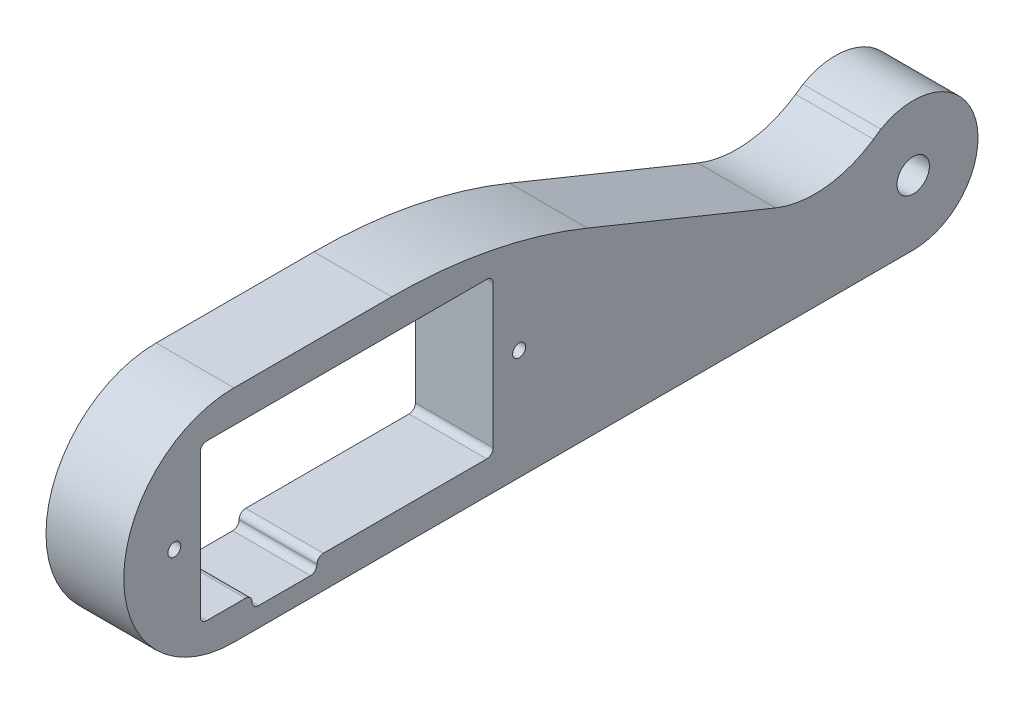
ISO-10303-21;
HEADER;
FILE_DESCRIPTION(('STEP AP214'),'2;1');
FILE_NAME('part.step','',(''),(''),'','','');
FILE_SCHEMA(('AUTOMOTIVE_DESIGN { 1 0 10303 214 1 1 1 1 }'));
ENDSEC;
DATA;
#1=APPLICATION_CONTEXT('core data for automotive mechanical design processes');
#2=APPLICATION_PROTOCOL_DEFINITION('international standard','automotive_design',2000,#1);
#3=PRODUCT_CONTEXT('',#1,'mechanical');
#4=PRODUCT('Part','Part','',(#3));
#5=PRODUCT_RELATED_PRODUCT_CATEGORY('part','',(#4));
#6=PRODUCT_DEFINITION_FORMATION('','',#4);
#7=PRODUCT_DEFINITION_CONTEXT('part definition',#1,'design');
#8=PRODUCT_DEFINITION('design','',#6,#7);
#9=PRODUCT_DEFINITION_SHAPE('','',#8);
#10=(LENGTH_UNIT() NAMED_UNIT(*) SI_UNIT(.MILLI.,.METRE.));
#11=(NAMED_UNIT(*) PLANE_ANGLE_UNIT() SI_UNIT($,.RADIAN.));
#12=(NAMED_UNIT(*) SI_UNIT($,.STERADIAN.) SOLID_ANGLE_UNIT());
#13=UNCERTAINTY_MEASURE_WITH_UNIT(LENGTH_MEASURE(1.E-05),#10,'distance_accuracy_value','');
#14=(GEOMETRIC_REPRESENTATION_CONTEXT(3) GLOBAL_UNCERTAINTY_ASSIGNED_CONTEXT((#13)) GLOBAL_UNIT_ASSIGNED_CONTEXT((#10,
#11,#12)) REPRESENTATION_CONTEXT('',''));
#15=CARTESIAN_POINT('',(0.,0.,0.));
#16=DIRECTION('',(0.,0.,1.));
#17=DIRECTION('',(1.,0.,0.));
#18=AXIS2_PLACEMENT_3D('',#15,#16,#17);
#19=CARTESIAN_POINT('',(6.,-25.5,-14.766012454293));
#20=DIRECTION('',(-1.,0.,0.));
#21=DIRECTION('',(0.,0.,1.));
#22=AXIS2_PLACEMENT_3D('',#19,#20,#21);
#23=CYLINDRICAL_SURFACE('',#22,40.);
#24=DIRECTION('',(-1.,0.,0.));
#25=VECTOR('',#24,1.);
#26=CARTESIAN_POINT('',(6.,14.5,-14.766012454293));
#27=LINE('',#26,#25);
#28=CARTESIAN_POINT('',(6.,14.5,-14.766012454293));
#29=VERTEX_POINT('',#28);
#30=CARTESIAN_POINT('',(0.,14.5,-14.766012454293));
#31=VERTEX_POINT('',#30);
#32=EDGE_CURVE('E300',#29,#31,#27,.T.);
#33=ORIENTED_EDGE('',*,*,#32,.F.);
#34=CARTESIAN_POINT('',(6.,-25.5,-14.766012454293));
#35=DIRECTION('',(1.,0.,0.));
#36=DIRECTION('',(0.,0.,-1.));
#37=AXIS2_PLACEMENT_3D('',#34,#35,#36);
#38=CIRCLE('',#37,40.);
#39=CARTESIAN_POINT('',(6.,11.5447854194722,-29.8552096902383));
#40=VERTEX_POINT('',#39);
#41=EDGE_CURVE('E306',#40,#29,#38,.T.);
#42=ORIENTED_EDGE('',*,*,#41,.F.);
#43=DIRECTION('',(-1.,0.,0.));
#44=VECTOR('',#43,1.);
#45=CARTESIAN_POINT('',(6.,11.5447854194722,-29.8552096902383));
#46=LINE('',#45,#44);
#47=CARTESIAN_POINT('',(0.,11.5447854194722,-29.8552096902383));
#48=VERTEX_POINT('',#47);
#49=EDGE_CURVE('E303',#48,#40,#46,.F.);
#50=ORIENTED_EDGE('',*,*,#49,.F.);
#51=CARTESIAN_POINT('',(0.,-25.5,-14.766012454293));
#52=DIRECTION('',(1.,0.,0.));
#53=DIRECTION('',(0.,0.,-1.));
#54=AXIS2_PLACEMENT_3D('',#51,#52,#53);
#55=CIRCLE('',#54,40.);
#56=EDGE_CURVE('E308',#31,#48,#55,.F.);
#57=ORIENTED_EDGE('',*,*,#56,.F.);
#58=EDGE_LOOP('',(#33,#42,#50,#57));
#59=FACE_BOUND('',#58,.T.);
#60=ADVANCED_FACE('F38',(#59),#23,.T.);
#61=CARTESIAN_POINT('',(6.,13.0351102224386,-47.4036076154779));
#62=DIRECTION('',(-1.,0.,0.));
#63=DIRECTION('',(0.,0.,1.));
#64=AXIS2_PLACEMENT_3D('',#61,#62,#63);
#65=CYLINDRICAL_SURFACE('',#64,8.);
#66=DIRECTION('',(1.,0.,0.));
#67=VECTOR('',#66,1.);
#68=CARTESIAN_POINT('',(6.,6.44000783465699,-51.9318108457534));
#69=LINE('',#68,#67);
#70=CARTESIAN_POINT('',(0.,6.44000783465699,-51.9318108457534));
#71=VERTEX_POINT('',#70);
#72=CARTESIAN_POINT('',(6.,6.44000783465699,-51.9318108457534));
#73=VERTEX_POINT('',#72);
#74=EDGE_CURVE('E200',#71,#73,#69,.T.);
#75=ORIENTED_EDGE('',*,*,#74,.F.);
#76=CARTESIAN_POINT('',(0.,13.0351102224386,-47.4036076154779));
#77=DIRECTION('',(1.,0.,0.));
#78=DIRECTION('',(0.,0.,-1.));
#79=AXIS2_PLACEMENT_3D('',#76,#77,#78);
#80=CIRCLE('',#79,8.);
#81=CARTESIAN_POINT('',(0.,5.62615313854414,-44.3857681682888));
#82=VERTEX_POINT('',#81);
#83=EDGE_CURVE('E295',#71,#82,#80,.F.);
#84=ORIENTED_EDGE('',*,*,#83,.T.);
#85=DIRECTION('',(1.,0.,0.));
#86=VECTOR('',#85,1.);
#87=CARTESIAN_POINT('',(6.,5.62615313854414,-44.3857681682889));
#88=LINE('',#87,#86);
#89=CARTESIAN_POINT('',(6.,5.62615313854414,-44.3857681682888));
#90=VERTEX_POINT('',#89);
#91=EDGE_CURVE('E292',#90,#82,#88,.F.);
#92=ORIENTED_EDGE('',*,*,#91,.F.);
#93=CARTESIAN_POINT('',(6.,13.0351102224386,-47.4036076154779));
#94=DIRECTION('',(1.,0.,0.));
#95=DIRECTION('',(0.,0.,-1.));
#96=AXIS2_PLACEMENT_3D('',#93,#94,#95);
#97=CIRCLE('',#96,8.);
#98=EDGE_CURVE('E298',#90,#73,#97,.T.);
#99=ORIENTED_EDGE('',*,*,#98,.T.);
#100=EDGE_LOOP('',(#75,#84,#92,#99));
#101=FACE_BOUND('',#100,.T.);
#102=ADVANCED_FACE('F454',(#101),#65,.F.);
#103=CARTESIAN_POINT('',(6.,0.,0.));
#104=DIRECTION('',(0.,1.,0.));
#105=DIRECTION('',(0.,0.,1.));
#106=AXIS2_PLACEMENT_3D('',#103,#104,#105);
#107=PLANE('',#106);
#108=DIRECTION('',(0.,0.,-1.));
#109=VECTOR('',#108,1.);
#110=CARTESIAN_POINT('',(0.,0.,0.));
#111=LINE('',#110,#109);
#112=CARTESIAN_POINT('',(0.,0.,-9.5));
#113=VERTEX_POINT('',#112);
#114=CARTESIAN_POINT('',(0.,0.,-22.1));
#115=VERTEX_POINT('',#114);
#116=EDGE_CURVE('E267',#113,#115,#111,.T.);
#117=ORIENTED_EDGE('',*,*,#116,.F.);
#118=DIRECTION('',(-1.,0.,0.));
#119=VECTOR('',#118,1.);
#120=CARTESIAN_POINT('',(6.,0.,-9.5));
#121=LINE('',#120,#119);
#122=CARTESIAN_POINT('',(6.,0.,-9.5));
#123=VERTEX_POINT('',#122);
#124=EDGE_CURVE('E331',#113,#123,#121,.F.);
#125=ORIENTED_EDGE('',*,*,#124,.T.);
#126=DIRECTION('',(0.,0.,-1.));
#127=VECTOR('',#126,1.);
#128=CARTESIAN_POINT('',(6.,0.,0.));
#129=LINE('',#128,#127);
#130=CARTESIAN_POINT('',(6.,0.,-22.1));
#131=VERTEX_POINT('',#130);
#132=EDGE_CURVE('E229',#123,#131,#129,.T.);
#133=ORIENTED_EDGE('',*,*,#132,.T.);
#134=DIRECTION('',(-1.,0.,0.));
#135=VECTOR('',#134,1.);
#136=CARTESIAN_POINT('',(6.,0.,-22.1));
#137=LINE('',#136,#135);
#138=EDGE_CURVE('E328',#131,#115,#137,.T.);
#139=ORIENTED_EDGE('',*,*,#138,.T.);
#140=EDGE_LOOP('',(#117,#125,#133,#139));
#141=FACE_BOUND('',#140,.T.);
#142=ADVANCED_FACE('F388',(#141),#107,.T.);
#143=CARTESIAN_POINT('',(6.,-1.,0.));
#144=DIRECTION('',(0.,1.,0.));
#145=DIRECTION('',(0.,0.,1.));
#146=AXIS2_PLACEMENT_3D('',#143,#144,#145);
#147=PLANE('',#146);
#148=DIRECTION('',(0.,0.,-1.));
#149=VECTOR('',#148,1.);
#150=CARTESIAN_POINT('',(0.,-1.,0.));
#151=LINE('',#150,#149);
#152=CARTESIAN_POINT('',(0.,-1.,-4.5));
#153=VERTEX_POINT('',#152);
#154=CARTESIAN_POINT('',(0.,-1.,-8.5));
#155=VERTEX_POINT('',#154);
#156=EDGE_CURVE('E270',#153,#155,#151,.T.);
#157=ORIENTED_EDGE('',*,*,#156,.F.);
#158=DIRECTION('',(-1.,0.,0.));
#159=VECTOR('',#158,1.);
#160=CARTESIAN_POINT('',(6.,-1.,-4.5));
#161=LINE('',#160,#159);
#162=CARTESIAN_POINT('',(6.,-1.,-4.5));
#163=VERTEX_POINT('',#162);
#164=EDGE_CURVE('E326',#153,#163,#161,.F.);
#165=ORIENTED_EDGE('',*,*,#164,.T.);
#166=DIRECTION('',(0.,0.,-1.));
#167=VECTOR('',#166,1.);
#168=CARTESIAN_POINT('',(6.,-1.,0.));
#169=LINE('',#168,#167);
#170=CARTESIAN_POINT('',(6.,-1.,-8.5));
#171=VERTEX_POINT('',#170);
#172=EDGE_CURVE('E232',#163,#171,#169,.T.);
#173=ORIENTED_EDGE('',*,*,#172,.T.);
#174=DIRECTION('',(-1.,0.,0.));
#175=VECTOR('',#174,1.);
#176=CARTESIAN_POINT('',(6.,-1.,-8.5));
#177=LINE('',#176,#175);
#178=EDGE_CURVE('E323',#171,#155,#177,.T.);
#179=ORIENTED_EDGE('',*,*,#178,.T.);
#180=EDGE_LOOP('',(#157,#165,#173,#179));
#181=FACE_BOUND('',#180,.T.);
#182=ADVANCED_FACE('F432',(#181),#147,.T.);
#183=CARTESIAN_POINT('',(6.,0.,-0.5));
#184=VERTEX_POINT('',#183);
#185=CARTESIAN_POINT('',(6.,0.,-3.5));
#186=VERTEX_POINT('',#185);
#187=EDGE_CURVE('E233',#184,#186,#129,.T.);
#188=ORIENTED_EDGE('',*,*,#187,.T.);
#189=DIRECTION('',(-1.,0.,0.));
#190=VECTOR('',#189,1.);
#191=CARTESIAN_POINT('',(6.,0.,-3.5));
#192=LINE('',#191,#190);
#193=CARTESIAN_POINT('',(0.,0.,-3.5));
#194=VERTEX_POINT('',#193);
#195=EDGE_CURVE('E312',#186,#194,#192,.T.);
#196=ORIENTED_EDGE('',*,*,#195,.T.);
#197=CARTESIAN_POINT('',(0.,0.,-0.5));
#198=VERTEX_POINT('',#197);
#199=EDGE_CURVE('E271',#198,#194,#111,.T.);
#200=ORIENTED_EDGE('',*,*,#199,.F.);
#201=DIRECTION('',(-1.,0.,0.));
#202=VECTOR('',#201,1.);
#203=CARTESIAN_POINT('',(6.,0.,-0.5));
#204=LINE('',#203,#202);
#205=EDGE_CURVE('E310',#198,#184,#204,.F.);
#206=ORIENTED_EDGE('',*,*,#205,.T.);
#207=EDGE_LOOP('',(#188,#196,#200,#206));
#208=FACE_BOUND('',#207,.T.);
#209=ADVANCED_FACE('F420',(#208),#107,.T.);
#210=CARTESIAN_POINT('',(6.,0.,0.));
#211=DIRECTION('',(0.,0.,-1.));
#212=DIRECTION('',(-1.,0.,0.));
#213=AXIS2_PLACEMENT_3D('',#210,#211,#212);
#214=PLANE('',#213);
#215=DIRECTION('',(0.,-1.,0.));
#216=VECTOR('',#215,1.);
#217=CARTESIAN_POINT('',(6.,0.,0.));
#218=LINE('',#217,#216);
#219=CARTESIAN_POINT('',(6.,11.5,0.));
#220=VERTEX_POINT('',#219);
#221=CARTESIAN_POINT('',(6.,0.5,0.));
#222=VERTEX_POINT('',#221);
#223=EDGE_CURVE('E236',#220,#222,#218,.T.);
#224=ORIENTED_EDGE('',*,*,#223,.T.);
#225=DIRECTION('',(-1.,0.,0.));
#226=VECTOR('',#225,1.);
#227=CARTESIAN_POINT('',(0.,0.5,0.));
#228=LINE('',#227,#226);
#229=CARTESIAN_POINT('',(0.,0.5,0.));
#230=VERTEX_POINT('',#229);
#231=EDGE_CURVE('E339',#222,#230,#228,.T.);
#232=ORIENTED_EDGE('',*,*,#231,.T.);
#233=DIRECTION('',(0.,-1.,0.));
#234=VECTOR('',#233,1.);
#235=CARTESIAN_POINT('',(0.,0.,0.));
#236=LINE('',#235,#234);
#237=CARTESIAN_POINT('',(0.,11.5,0.));
#238=VERTEX_POINT('',#237);
#239=EDGE_CURVE('E274',#238,#230,#236,.T.);
#240=ORIENTED_EDGE('',*,*,#239,.F.);
#241=DIRECTION('',(-1.,0.,0.));
#242=VECTOR('',#241,1.);
#243=CARTESIAN_POINT('',(6.,11.5,0.));
#244=LINE('',#243,#242);
#245=EDGE_CURVE('E337',#238,#220,#244,.F.);
#246=ORIENTED_EDGE('',*,*,#245,.T.);
#247=EDGE_LOOP('',(#224,#232,#240,#246));
#248=FACE_BOUND('',#247,.T.);
#249=ADVANCED_FACE('F410',(#248),#214,.T.);
#250=CARTESIAN_POINT('',(6.,12.,0.));
#251=DIRECTION('',(0.,1.,0.));
#252=DIRECTION('',(0.,0.,1.));
#253=AXIS2_PLACEMENT_3D('',#250,#251,#252);
#254=PLANE('',#253);
#255=DIRECTION('',(0.,0.,-1.));
#256=VECTOR('',#255,1.);
#257=CARTESIAN_POINT('',(6.,12.,0.));
#258=LINE('',#257,#256);
#259=CARTESIAN_POINT('',(6.,12.,-0.5));
#260=VERTEX_POINT('',#259);
#261=CARTESIAN_POINT('',(6.,12.,-22.1));
#262=VERTEX_POINT('',#261);
#263=EDGE_CURVE('E239',#260,#262,#258,.T.);
#264=ORIENTED_EDGE('',*,*,#263,.F.);
#265=DIRECTION('',(-1.,0.,0.));
#266=VECTOR('',#265,1.);
#267=CARTESIAN_POINT('',(6.,12.,-0.5));
#268=LINE('',#267,#266);
#269=CARTESIAN_POINT('',(0.,12.,-0.5));
#270=VERTEX_POINT('',#269);
#271=EDGE_CURVE('E344',#260,#270,#268,.T.);
#272=ORIENTED_EDGE('',*,*,#271,.T.);
#273=DIRECTION('',(0.,0.,-1.));
#274=VECTOR('',#273,1.);
#275=CARTESIAN_POINT('',(0.,12.,0.));
#276=LINE('',#275,#274);
#277=CARTESIAN_POINT('',(0.,12.,-22.1));
#278=VERTEX_POINT('',#277);
#279=EDGE_CURVE('E277',#270,#278,#276,.T.);
#280=ORIENTED_EDGE('',*,*,#279,.T.);
#281=DIRECTION('',(-1.,0.,0.));
#282=VECTOR('',#281,1.);
#283=CARTESIAN_POINT('',(6.,12.,-22.1));
#284=LINE('',#283,#282);
#285=EDGE_CURVE('E342',#278,#262,#284,.F.);
#286=ORIENTED_EDGE('',*,*,#285,.T.);
#287=EDGE_LOOP('',(#264,#272,#280,#286));
#288=FACE_BOUND('',#287,.T.);
#289=ADVANCED_FACE('F402',(#288),#254,.F.);
#290=CARTESIAN_POINT('',(6.,6.,-2.6));
#291=DIRECTION('',(-1.,0.,0.));
#292=DIRECTION('',(0.,0.,1.));
#293=AXIS2_PLACEMENT_3D('',#290,#291,#292);
#294=CYLINDRICAL_SURFACE('',#293,8.5);
#295=CARTESIAN_POINT('',(0.,6.,-2.6));
#296=DIRECTION('',(1.,0.,0.));
#297=DIRECTION('',(0.,0.,-1.));
#298=AXIS2_PLACEMENT_3D('',#295,#296,#297);
#299=CIRCLE('',#298,8.5);
#300=CARTESIAN_POINT('',(0.,-2.5,-2.6));
#301=VERTEX_POINT('',#300);
#302=CARTESIAN_POINT('',(0.,14.5,-2.6));
#303=VERTEX_POINT('',#302);
#304=EDGE_CURVE('E196',#301,#303,#299,.F.);
#305=ORIENTED_EDGE('',*,*,#304,.F.);
#306=DIRECTION('',(-1.,0.,0.));
#307=VECTOR('',#306,1.);
#308=CARTESIAN_POINT('',(6.,-2.5,-2.6));
#309=LINE('',#308,#307);
#310=CARTESIAN_POINT('',(6.,-2.5,-2.6));
#311=VERTEX_POINT('',#310);
#312=EDGE_CURVE('E189',#311,#301,#309,.T.);
#313=ORIENTED_EDGE('',*,*,#312,.F.);
#314=CARTESIAN_POINT('',(6.,6.,-2.6));
#315=DIRECTION('',(1.,0.,0.));
#316=DIRECTION('',(0.,0.,-1.));
#317=AXIS2_PLACEMENT_3D('',#314,#315,#316);
#318=CIRCLE('',#317,8.5);
#319=CARTESIAN_POINT('',(6.,14.5,-2.6));
#320=VERTEX_POINT('',#319);
#321=EDGE_CURVE('E193',#311,#320,#318,.F.);
#322=ORIENTED_EDGE('',*,*,#321,.T.);
#323=DIRECTION('',(-1.,0.,0.));
#324=VECTOR('',#323,1.);
#325=CARTESIAN_POINT('',(6.,14.5,-2.6));
#326=LINE('',#325,#324);
#327=EDGE_CURVE('E246',#320,#303,#326,.T.);
#328=ORIENTED_EDGE('',*,*,#327,.T.);
#329=EDGE_LOOP('',(#305,#313,#322,#328));
#330=FACE_BOUND('',#329,.T.);
#331=ADVANCED_FACE('F191',(#330),#294,.T.);
#332=CARTESIAN_POINT('',(6.,-2.5,0.));
#333=DIRECTION('',(0.,1.,0.));
#334=DIRECTION('',(0.,0.,1.));
#335=AXIS2_PLACEMENT_3D('',#332,#333,#334);
#336=PLANE('',#335);
#337=DIRECTION('',(0.,0.,-1.));
#338=VECTOR('',#337,1.);
#339=CARTESIAN_POINT('',(0.,-2.5,0.));
#340=LINE('',#339,#338);
#341=CARTESIAN_POINT('',(0.,-2.49999999999999,-55.));
#342=VERTEX_POINT('',#341);
#343=EDGE_CURVE('E255',#301,#342,#340,.T.);
#344=ORIENTED_EDGE('',*,*,#343,.T.);
#345=DIRECTION('',(-1.,0.,0.));
#346=VECTOR('',#345,1.);
#347=CARTESIAN_POINT('',(6.,-2.49999999999999,-55.));
#348=LINE('',#347,#346);
#349=CARTESIAN_POINT('',(6.,-2.49999999999999,-55.));
#350=VERTEX_POINT('',#349);
#351=EDGE_CURVE('E201',#350,#342,#348,.T.);
#352=ORIENTED_EDGE('',*,*,#351,.F.);
#353=DIRECTION('',(0.,0.,-1.));
#354=VECTOR('',#353,1.);
#355=CARTESIAN_POINT('',(6.,-2.5,0.));
#356=LINE('',#355,#354);
#357=EDGE_CURVE('E205',#311,#350,#356,.T.);
#358=ORIENTED_EDGE('',*,*,#357,.F.);
#359=ORIENTED_EDGE('',*,*,#312,.T.);
#360=EDGE_LOOP('',(#344,#352,#358,#359));
#361=FACE_BOUND('',#360,.T.);
#362=ADVANCED_FACE('F206',(#361),#336,.F.);
#363=CARTESIAN_POINT('',(6.,2.5,-55.));
#364=DIRECTION('',(-1.,0.,0.));
#365=DIRECTION('',(0.,0.,1.));
#366=AXIS2_PLACEMENT_3D('',#363,#364,#365);
#367=CYLINDRICAL_SURFACE('',#366,4.99999999999999);
#368=CARTESIAN_POINT('',(0.,2.5,-55.));
#369=DIRECTION('',(1.,0.,0.));
#370=DIRECTION('',(0.,0.,-1.));
#371=AXIS2_PLACEMENT_3D('',#368,#369,#370);
#372=CIRCLE('',#371,4.99999999999999);
#373=CARTESIAN_POINT('',(0.,6.83012701892219,-52.5));
#374=VERTEX_POINT('',#373);
#375=EDGE_CURVE('E257',#342,#374,#372,.T.);
#376=ORIENTED_EDGE('',*,*,#375,.T.);
#377=DIRECTION('',(-1.,0.,0.));
#378=VECTOR('',#377,1.);
#379=CARTESIAN_POINT('',(6.,6.83012701892219,-52.5));
#380=LINE('',#379,#378);
#381=CARTESIAN_POINT('',(6.,6.83012701892219,-52.5));
#382=VERTEX_POINT('',#381);
#383=EDGE_CURVE('E286',#382,#374,#380,.T.);
#384=ORIENTED_EDGE('',*,*,#383,.F.);
#385=CARTESIAN_POINT('',(6.,2.5,-55.));
#386=DIRECTION('',(1.,0.,0.));
#387=DIRECTION('',(0.,0.,-1.));
#388=AXIS2_PLACEMENT_3D('',#385,#386,#387);
#389=CIRCLE('',#388,4.99999999999999);
#390=EDGE_CURVE('E210',#350,#382,#389,.T.);
#391=ORIENTED_EDGE('',*,*,#390,.F.);
#392=ORIENTED_EDGE('',*,*,#351,.T.);
#393=EDGE_LOOP('',(#376,#384,#391,#392));
#394=FACE_BOUND('',#393,.T.);
#395=ADVANCED_FACE('F619',(#394),#367,.T.);
#396=CARTESIAN_POINT('',(6.,-19.8559244878332,-13.6330956093248));
#397=DIRECTION('',(0.,0.824387798472699,0.566025403784438));
#398=DIRECTION('',(0.,-0.566025403784438,0.824387798472699));
#399=AXIS2_PLACEMENT_3D('',#396,#397,#398);
#400=PLANE('',#399);
#401=DIRECTION('',(0.,0.566025403784438,-0.824387798472699));
#402=VECTOR('',#401,1.);
#403=CARTESIAN_POINT('',(0.,-19.8559244878332,-13.6330956093248));
#404=LINE('',#403,#402);
#405=EDGE_CURVE('E260',#71,#374,#404,.T.);
#406=ORIENTED_EDGE('',*,*,#405,.F.);
#407=ORIENTED_EDGE('',*,*,#74,.T.);
#408=DIRECTION('',(0.,0.566025403784438,-0.824387798472699));
#409=VECTOR('',#408,1.);
#410=CARTESIAN_POINT('',(6.,-19.8559244878332,-13.6330956093248));
#411=LINE('',#410,#409);
#412=EDGE_CURVE('E224',#73,#382,#411,.T.);
#413=ORIENTED_EDGE('',*,*,#412,.T.);
#414=ORIENTED_EDGE('',*,*,#383,.T.);
#415=EDGE_LOOP('',(#406,#407,#413,#414));
#416=FACE_BOUND('',#415,.T.);
#417=ADVANCED_FACE('F605',(#416),#400,.T.);
#418=CARTESIAN_POINT('',(6.,20.3321519407234,-8.28175537773583));
#419=DIRECTION('',(0.,0.926119635486805,-0.377229930898633));
#420=DIRECTION('',(0.,0.377229930898633,0.926119635486805));
#421=AXIS2_PLACEMENT_3D('',#418,#419,#420);
#422=PLANE('',#421);
#423=DIRECTION('',(0.,-0.377229930898633,-0.926119635486805));
#424=VECTOR('',#423,1.);
#425=CARTESIAN_POINT('',(0.,20.3321519407234,-8.28175537773583));
#426=LINE('',#425,#424);
#427=EDGE_CURVE('E262',#48,#82,#426,.T.);
#428=ORIENTED_EDGE('',*,*,#427,.F.);
#429=ORIENTED_EDGE('',*,*,#49,.T.);
#430=DIRECTION('',(0.,-0.377229930898633,-0.926119635486805));
#431=VECTOR('',#430,1.);
#432=CARTESIAN_POINT('',(6.,20.3321519407234,-8.28175537773583));
#433=LINE('',#432,#431);
#434=EDGE_CURVE('E226',#40,#90,#433,.T.);
#435=ORIENTED_EDGE('',*,*,#434,.T.);
#436=ORIENTED_EDGE('',*,*,#91,.T.);
#437=EDGE_LOOP('',(#428,#429,#435,#436));
#438=FACE_BOUND('',#437,.T.);
#439=ADVANCED_FACE('F544',(#438),#422,.T.);
#440=CARTESIAN_POINT('',(6.,0.,-22.6));
#441=DIRECTION('',(0.,0.,-1.));
#442=DIRECTION('',(-1.,0.,0.));
#443=AXIS2_PLACEMENT_3D('',#440,#441,#442);
#444=PLANE('',#443);
#445=DIRECTION('',(0.,-1.,0.));
#446=VECTOR('',#445,1.);
#447=CARTESIAN_POINT('',(0.,0.,-22.6));
#448=LINE('',#447,#446);
#449=CARTESIAN_POINT('',(0.,11.5,-22.6));
#450=VERTEX_POINT('',#449);
#451=CARTESIAN_POINT('',(0.,0.5,-22.6));
#452=VERTEX_POINT('',#451);
#453=EDGE_CURVE('E280',#450,#452,#448,.T.);
#454=ORIENTED_EDGE('',*,*,#453,.T.);
#455=DIRECTION('',(-1.,0.,0.));
#456=VECTOR('',#455,1.);
#457=CARTESIAN_POINT('',(6.,0.5,-22.6));
#458=LINE('',#457,#456);
#459=CARTESIAN_POINT('',(6.,0.5,-22.6));
#460=VERTEX_POINT('',#459);
#461=EDGE_CURVE('E55',#452,#460,#458,.F.);
#462=ORIENTED_EDGE('',*,*,#461,.T.);
#463=DIRECTION('',(0.,-1.,0.));
#464=VECTOR('',#463,1.);
#465=CARTESIAN_POINT('',(6.,0.,-22.6));
#466=LINE('',#465,#464);
#467=CARTESIAN_POINT('',(6.,11.5,-22.6));
#468=VERTEX_POINT('',#467);
#469=EDGE_CURVE('E241',#468,#460,#466,.T.);
#470=ORIENTED_EDGE('',*,*,#469,.F.);
#471=DIRECTION('',(-1.,0.,0.));
#472=VECTOR('',#471,1.);
#473=CARTESIAN_POINT('',(0.,11.5,-22.6));
#474=LINE('',#473,#472);
#475=EDGE_CURVE('E333',#468,#450,#474,.T.);
#476=ORIENTED_EDGE('',*,*,#475,.T.);
#477=EDGE_LOOP('',(#454,#462,#470,#476));
#478=FACE_BOUND('',#477,.T.);
#479=ADVANCED_FACE('F395',(#478),#444,.F.);
#480=CARTESIAN_POINT('',(6.,14.5,0.));
#481=DIRECTION('',(0.,1.,0.));
#482=DIRECTION('',(0.,0.,1.));
#483=AXIS2_PLACEMENT_3D('',#480,#481,#482);
#484=PLANE('',#483);
#485=DIRECTION('',(0.,0.,-1.));
#486=VECTOR('',#485,1.);
#487=CARTESIAN_POINT('',(6.,14.5,0.));
#488=LINE('',#487,#486);
#489=EDGE_CURVE('E215',#320,#29,#488,.T.);
#490=ORIENTED_EDGE('',*,*,#489,.T.);
#491=ORIENTED_EDGE('',*,*,#32,.T.);
#492=DIRECTION('',(0.,0.,-1.));
#493=VECTOR('',#492,1.);
#494=CARTESIAN_POINT('',(0.,14.5,0.));
#495=LINE('',#494,#493);
#496=EDGE_CURVE('E264',#303,#31,#495,.T.);
#497=ORIENTED_EDGE('',*,*,#496,.F.);
#498=ORIENTED_EDGE('',*,*,#327,.F.);
#499=EDGE_LOOP('',(#490,#491,#497,#498));
#500=FACE_BOUND('',#499,.T.);
#501=ADVANCED_FACE('F543',(#500),#484,.T.);
#502=CARTESIAN_POINT('',(6.,6.,-24.6));
#503=DIRECTION('',(-1.,0.,0.));
#504=DIRECTION('',(0.,0.,1.));
#505=AXIS2_PLACEMENT_3D('',#502,#503,#504);
#506=CYLINDRICAL_SURFACE('',#505,0.499999999999999);
#507=CARTESIAN_POINT('',(6.,6.,-24.6));
#508=DIRECTION('',(1.,0.,0.));
#509=DIRECTION('',(0.,0.,-1.));
#510=AXIS2_PLACEMENT_3D('',#507,#508,#509);
#511=CIRCLE('',#510,0.499999999999999);
#512=CARTESIAN_POINT('',(6.,6.,-25.1));
#513=VERTEX_POINT('',#512);
#514=EDGE_CURVE('E216',#513,#513,#511,.T.);
#515=ORIENTED_EDGE('',*,*,#514,.T.);
#516=EDGE_LOOP('',(#515));
#517=FACE_BOUND('',#516,.T.);
#518=CARTESIAN_POINT('',(0.,6.,-24.6));
#519=DIRECTION('',(1.,0.,0.));
#520=DIRECTION('',(0.,0.,-1.));
#521=AXIS2_PLACEMENT_3D('',#518,#519,#520);
#522=CIRCLE('',#521,0.499999999999999);
#523=CARTESIAN_POINT('',(0.,6.,-25.1));
#524=VERTEX_POINT('',#523);
#525=EDGE_CURVE('E250',#524,#524,#522,.T.);
#526=ORIENTED_EDGE('',*,*,#525,.F.);
#527=EDGE_LOOP('',(#526));
#528=FACE_BOUND('',#527,.T.);
#529=ADVANCED_FACE('F596',(#517,#528),#506,.F.);
#530=CARTESIAN_POINT('',(6.,6.,2.));
#531=DIRECTION('',(-1.,0.,0.));
#532=DIRECTION('',(0.,0.,1.));
#533=AXIS2_PLACEMENT_3D('',#530,#531,#532);
#534=CYLINDRICAL_SURFACE('',#533,0.5);
#535=CARTESIAN_POINT('',(6.,6.,2.));
#536=DIRECTION('',(1.,0.,0.));
#537=DIRECTION('',(0.,0.,-1.));
#538=AXIS2_PLACEMENT_3D('',#535,#536,#537);
#539=CIRCLE('',#538,0.5);
#540=CARTESIAN_POINT('',(6.,6.,1.5));
#541=VERTEX_POINT('',#540);
#542=EDGE_CURVE('E219',#541,#541,#539,.T.);
#543=ORIENTED_EDGE('',*,*,#542,.T.);
#544=EDGE_LOOP('',(#543));
#545=FACE_BOUND('',#544,.T.);
#546=CARTESIAN_POINT('',(0.,6.,2.));
#547=DIRECTION('',(1.,0.,0.));
#548=DIRECTION('',(0.,0.,-1.));
#549=AXIS2_PLACEMENT_3D('',#546,#547,#548);
#550=CIRCLE('',#549,0.5);
#551=CARTESIAN_POINT('',(0.,6.,1.5));
#552=VERTEX_POINT('',#551);
#553=EDGE_CURVE('E247',#552,#552,#550,.T.);
#554=ORIENTED_EDGE('',*,*,#553,.F.);
#555=EDGE_LOOP('',(#554));
#556=FACE_BOUND('',#555,.T.);
#557=ADVANCED_FACE('F442',(#545,#556),#534,.F.);
#558=CARTESIAN_POINT('',(6.,2.5,-55.));
#559=DIRECTION('',(-1.,0.,0.));
#560=DIRECTION('',(0.,0.,1.));
#561=AXIS2_PLACEMENT_3D('',#558,#559,#560);
#562=CYLINDRICAL_SURFACE('',#561,1.25);
#563=CARTESIAN_POINT('',(6.,2.5,-55.));
#564=DIRECTION('',(1.,0.,0.));
#565=DIRECTION('',(0.,0.,-1.));
#566=AXIS2_PLACEMENT_3D('',#563,#564,#565);
#567=CIRCLE('',#566,1.25);
#568=CARTESIAN_POINT('',(6.,2.5,-56.25));
#569=VERTEX_POINT('',#568);
#570=EDGE_CURVE('E243',#569,#569,#567,.T.);
#571=ORIENTED_EDGE('',*,*,#570,.T.);
#572=EDGE_LOOP('',(#571));
#573=FACE_BOUND('',#572,.T.);
#574=CARTESIAN_POINT('',(0.,2.5,-55.));
#575=DIRECTION('',(1.,0.,0.));
#576=DIRECTION('',(0.,0.,-1.));
#577=AXIS2_PLACEMENT_3D('',#574,#575,#576);
#578=CIRCLE('',#577,1.25);
#579=CARTESIAN_POINT('',(0.,2.5,-56.25));
#580=VERTEX_POINT('',#579);
#581=EDGE_CURVE('E282',#580,#580,#578,.T.);
#582=ORIENTED_EDGE('',*,*,#581,.F.);
#583=EDGE_LOOP('',(#582));
#584=FACE_BOUND('',#583,.T.);
#585=ADVANCED_FACE('F435',(#573,#584),#562,.F.);
#586=CARTESIAN_POINT('',(6.,0.,0.));
#587=DIRECTION('',(1.,0.,0.));
#588=DIRECTION('',(0.,0.,-1.));
#589=AXIS2_PLACEMENT_3D('',#586,#587,#588);
#590=PLANE('',#589);
#591=ORIENTED_EDGE('',*,*,#542,.F.);
#592=EDGE_LOOP('',(#591));
#593=FACE_BOUND('',#592,.T.);
#594=ORIENTED_EDGE('',*,*,#514,.F.);
#595=EDGE_LOOP('',(#594));
#596=FACE_BOUND('',#595,.T.);
#597=ORIENTED_EDGE('',*,*,#434,.F.);
#598=ORIENTED_EDGE('',*,*,#41,.T.);
#599=ORIENTED_EDGE('',*,*,#489,.F.);
#600=ORIENTED_EDGE('',*,*,#321,.F.);
#601=ORIENTED_EDGE('',*,*,#357,.T.);
#602=ORIENTED_EDGE('',*,*,#390,.T.);
#603=ORIENTED_EDGE('',*,*,#412,.F.);
#604=ORIENTED_EDGE('',*,*,#98,.F.);
#605=EDGE_LOOP('',(#597,#598,#599,#600,#601,#602,#603,#604));
#606=FACE_BOUND('',#605,.T.);
#607=ORIENTED_EDGE('',*,*,#172,.F.);
#608=CARTESIAN_POINT('',(6.,-0.5,-4.5));
#609=DIRECTION('',(1.,0.,0.));
#610=DIRECTION('',(0.,0.,-1.));
#611=AXIS2_PLACEMENT_3D('',#608,#609,#610);
#612=CIRCLE('',#611,0.5);
#613=CARTESIAN_POINT('',(6.,-0.5,-4.));
#614=VERTEX_POINT('',#613);
#615=EDGE_CURVE('E349',#163,#614,#612,.F.);
#616=ORIENTED_EDGE('',*,*,#615,.T.);
#617=CARTESIAN_POINT('',(6.,-0.5,-3.5));
#618=DIRECTION('',(1.,0.,0.));
#619=DIRECTION('',(0.,0.,-1.));
#620=AXIS2_PLACEMENT_3D('',#617,#618,#619);
#621=CIRCLE('',#620,0.5);
#622=EDGE_CURVE('E321',#614,#186,#621,.T.);
#623=ORIENTED_EDGE('',*,*,#622,.T.);
#624=ORIENTED_EDGE('',*,*,#187,.F.);
#625=CARTESIAN_POINT('',(6.,0.5,-0.5));
#626=DIRECTION('',(1.,0.,0.));
#627=DIRECTION('',(0.,0.,-1.));
#628=AXIS2_PLACEMENT_3D('',#625,#626,#627);
#629=CIRCLE('',#628,0.5);
#630=EDGE_CURVE('E361',#184,#222,#629,.F.);
#631=ORIENTED_EDGE('',*,*,#630,.T.);
#632=ORIENTED_EDGE('',*,*,#223,.F.);
#633=CARTESIAN_POINT('',(6.,11.5,-0.5));
#634=DIRECTION('',(1.,0.,0.));
#635=DIRECTION('',(0.,0.,-1.));
#636=AXIS2_PLACEMENT_3D('',#633,#634,#635);
#637=CIRCLE('',#636,0.5);
#638=EDGE_CURVE('E365',#220,#260,#637,.F.);
#639=ORIENTED_EDGE('',*,*,#638,.T.);
#640=ORIENTED_EDGE('',*,*,#263,.T.);
#641=CARTESIAN_POINT('',(6.,11.5,-22.1));
#642=DIRECTION('',(1.,0.,0.));
#643=DIRECTION('',(0.,0.,-1.));
#644=AXIS2_PLACEMENT_3D('',#641,#642,#643);
#645=CIRCLE('',#644,0.5);
#646=EDGE_CURVE('E11',#262,#468,#645,.F.);
#647=ORIENTED_EDGE('',*,*,#646,.T.);
#648=ORIENTED_EDGE('',*,*,#469,.T.);
#649=CARTESIAN_POINT('',(6.,0.5,-22.1));
#650=DIRECTION('',(1.,0.,0.));
#651=DIRECTION('',(0.,0.,-1.));
#652=AXIS2_PLACEMENT_3D('',#649,#650,#651);
#653=CIRCLE('',#652,0.5);
#654=EDGE_CURVE('E357',#460,#131,#653,.F.);
#655=ORIENTED_EDGE('',*,*,#654,.T.);
#656=ORIENTED_EDGE('',*,*,#132,.F.);
#657=CARTESIAN_POINT('',(6.,-0.5,-9.5));
#658=DIRECTION('',(1.,0.,0.));
#659=DIRECTION('',(0.,0.,-1.));
#660=AXIS2_PLACEMENT_3D('',#657,#658,#659);
#661=CIRCLE('',#660,0.5);
#662=CARTESIAN_POINT('',(6.,-0.5,-9.));
#663=VERTEX_POINT('',#662);
#664=EDGE_CURVE('E319',#123,#663,#661,.T.);
#665=ORIENTED_EDGE('',*,*,#664,.T.);
#666=CARTESIAN_POINT('',(6.,-0.5,-8.5));
#667=DIRECTION('',(1.,0.,0.));
#668=DIRECTION('',(0.,0.,-1.));
#669=AXIS2_PLACEMENT_3D('',#666,#667,#668);
#670=CIRCLE('',#669,0.5);
#671=EDGE_CURVE('E353',#663,#171,#670,.F.);
#672=ORIENTED_EDGE('',*,*,#671,.T.);
#673=EDGE_LOOP('',(#607,#616,#623,#624,#631,#632,#639,#640,#647,#648,#655,#656,#665,#672));
#674=FACE_BOUND('',#673,.T.);
#675=ORIENTED_EDGE('',*,*,#570,.F.);
#676=EDGE_LOOP('',(#675));
#677=FACE_BOUND('',#676,.T.);
#678=ADVANCED_FACE('F213',(#593,#596,#606,#674,#677),#590,.T.);
#679=CARTESIAN_POINT('',(0.,0.,0.));
#680=DIRECTION('',(1.,0.,0.));
#681=DIRECTION('',(0.,0.,-1.));
#682=AXIS2_PLACEMENT_3D('',#679,#680,#681);
#683=PLANE('',#682);
#684=ORIENTED_EDGE('',*,*,#496,.T.);
#685=ORIENTED_EDGE('',*,*,#56,.T.);
#686=ORIENTED_EDGE('',*,*,#427,.T.);
#687=ORIENTED_EDGE('',*,*,#83,.F.);
#688=ORIENTED_EDGE('',*,*,#405,.T.);
#689=ORIENTED_EDGE('',*,*,#375,.F.);
#690=ORIENTED_EDGE('',*,*,#343,.F.);
#691=ORIENTED_EDGE('',*,*,#304,.T.);
#692=EDGE_LOOP('',(#684,#685,#686,#687,#688,#689,#690,#691));
#693=FACE_BOUND('',#692,.T.);
#694=ORIENTED_EDGE('',*,*,#553,.T.);
#695=EDGE_LOOP('',(#694));
#696=FACE_BOUND('',#695,.T.);
#697=ORIENTED_EDGE('',*,*,#525,.T.);
#698=EDGE_LOOP('',(#697));
#699=FACE_BOUND('',#698,.T.);
#700=ORIENTED_EDGE('',*,*,#199,.T.);
#701=CARTESIAN_POINT('',(0.,-0.5,-3.5));
#702=DIRECTION('',(1.,0.,0.));
#703=DIRECTION('',(0.,0.,-1.));
#704=AXIS2_PLACEMENT_3D('',#701,#702,#703);
#705=CIRCLE('',#704,0.5);
#706=CARTESIAN_POINT('',(0.,-0.5,-4.));
#707=VERTEX_POINT('',#706);
#708=EDGE_CURVE('E317',#194,#707,#705,.F.);
#709=ORIENTED_EDGE('',*,*,#708,.T.);
#710=CARTESIAN_POINT('',(0.,-0.5,-4.5));
#711=DIRECTION('',(1.,0.,0.));
#712=DIRECTION('',(0.,0.,-1.));
#713=AXIS2_PLACEMENT_3D('',#710,#711,#712);
#714=CIRCLE('',#713,0.5);
#715=EDGE_CURVE('E347',#707,#153,#714,.T.);
#716=ORIENTED_EDGE('',*,*,#715,.T.);
#717=ORIENTED_EDGE('',*,*,#156,.T.);
#718=CARTESIAN_POINT('',(0.,-0.5,-8.5));
#719=DIRECTION('',(1.,0.,0.));
#720=DIRECTION('',(0.,0.,-1.));
#721=AXIS2_PLACEMENT_3D('',#718,#719,#720);
#722=CIRCLE('',#721,0.5);
#723=CARTESIAN_POINT('',(0.,-0.5,-9.));
#724=VERTEX_POINT('',#723);
#725=EDGE_CURVE('E351',#155,#724,#722,.T.);
#726=ORIENTED_EDGE('',*,*,#725,.T.);
#727=CARTESIAN_POINT('',(0.,-0.5,-9.5));
#728=DIRECTION('',(1.,0.,0.));
#729=DIRECTION('',(0.,0.,-1.));
#730=AXIS2_PLACEMENT_3D('',#727,#728,#729);
#731=CIRCLE('',#730,0.5);
#732=EDGE_CURVE('E315',#724,#113,#731,.F.);
#733=ORIENTED_EDGE('',*,*,#732,.T.);
#734=ORIENTED_EDGE('',*,*,#116,.T.);
#735=CARTESIAN_POINT('',(0.,0.5,-22.1));
#736=DIRECTION('',(1.,0.,0.));
#737=DIRECTION('',(0.,0.,-1.));
#738=AXIS2_PLACEMENT_3D('',#735,#736,#737);
#739=CIRCLE('',#738,0.5);
#740=EDGE_CURVE('E355',#115,#452,#739,.T.);
#741=ORIENTED_EDGE('',*,*,#740,.T.);
#742=ORIENTED_EDGE('',*,*,#453,.F.);
#743=CARTESIAN_POINT('',(0.,11.5,-22.1));
#744=DIRECTION('',(1.,0.,0.));
#745=DIRECTION('',(0.,0.,-1.));
#746=AXIS2_PLACEMENT_3D('',#743,#744,#745);
#747=CIRCLE('',#746,0.5);
#748=EDGE_CURVE('E47',#450,#278,#747,.T.);
#749=ORIENTED_EDGE('',*,*,#748,.T.);
#750=ORIENTED_EDGE('',*,*,#279,.F.);
#751=CARTESIAN_POINT('',(0.,11.5,-0.5));
#752=DIRECTION('',(1.,0.,0.));
#753=DIRECTION('',(0.,0.,-1.));
#754=AXIS2_PLACEMENT_3D('',#751,#752,#753);
#755=CIRCLE('',#754,0.5);
#756=EDGE_CURVE('E363',#270,#238,#755,.T.);
#757=ORIENTED_EDGE('',*,*,#756,.T.);
#758=ORIENTED_EDGE('',*,*,#239,.T.);
#759=CARTESIAN_POINT('',(0.,0.5,-0.5));
#760=DIRECTION('',(1.,0.,0.));
#761=DIRECTION('',(0.,0.,-1.));
#762=AXIS2_PLACEMENT_3D('',#759,#760,#761);
#763=CIRCLE('',#762,0.5);
#764=EDGE_CURVE('E359',#230,#198,#763,.T.);
#765=ORIENTED_EDGE('',*,*,#764,.T.);
#766=EDGE_LOOP('',(#700,#709,#716,#717,#726,#733,#734,#741,#742,#749,#750,#757,#758,#765));
#767=FACE_BOUND('',#766,.T.);
#768=ORIENTED_EDGE('',*,*,#581,.T.);
#769=EDGE_LOOP('',(#768));
#770=FACE_BOUND('',#769,.T.);
#771=ADVANCED_FACE('F385',(#693,#696,#699,#767,#770),#683,.F.);
#772=CARTESIAN_POINT('',(6.,-0.5,-4.5));
#773=DIRECTION('',(1.,0.,0.));
#774=DIRECTION('',(0.,0.,-1.));
#775=AXIS2_PLACEMENT_3D('',#772,#773,#774);
#776=CYLINDRICAL_SURFACE('',#775,0.5);
#777=DIRECTION('',(-1.,0.,0.));
#778=VECTOR('',#777,1.);
#779=CARTESIAN_POINT('',(0.,-0.5,-4.));
#780=LINE('',#779,#778);
#781=EDGE_CURVE('E251',#614,#707,#780,.T.);
#782=ORIENTED_EDGE('',*,*,#781,.F.);
#783=ORIENTED_EDGE('',*,*,#615,.F.);
#784=ORIENTED_EDGE('',*,*,#164,.F.);
#785=ORIENTED_EDGE('',*,*,#715,.F.);
#786=EDGE_LOOP('',(#782,#783,#784,#785));
#787=FACE_BOUND('',#786,.T.);
#788=ADVANCED_FACE('F428',(#787),#776,.F.);
#789=CARTESIAN_POINT('',(6.,-0.5,-3.5));
#790=DIRECTION('',(-1.,0.,0.));
#791=DIRECTION('',(0.,0.,1.));
#792=AXIS2_PLACEMENT_3D('',#789,#790,#791);
#793=CYLINDRICAL_SURFACE('',#792,0.5);
#794=ORIENTED_EDGE('',*,*,#622,.F.);
#795=ORIENTED_EDGE('',*,*,#781,.T.);
#796=ORIENTED_EDGE('',*,*,#708,.F.);
#797=ORIENTED_EDGE('',*,*,#195,.F.);
#798=EDGE_LOOP('',(#794,#795,#796,#797));
#799=FACE_BOUND('',#798,.T.);
#800=ADVANCED_FACE('F423',(#799),#793,.T.);
#801=CARTESIAN_POINT('',(6.,-0.5,-9.5));
#802=DIRECTION('',(1.,0.,0.));
#803=DIRECTION('',(0.,0.,-1.));
#804=AXIS2_PLACEMENT_3D('',#801,#802,#803);
#805=CYLINDRICAL_SURFACE('',#804,0.5);
#806=DIRECTION('',(-1.,0.,0.));
#807=VECTOR('',#806,1.);
#808=CARTESIAN_POINT('',(0.,-0.5,-9.));
#809=LINE('',#808,#807);
#810=EDGE_CURVE('E42',#663,#724,#809,.T.);
#811=ORIENTED_EDGE('',*,*,#810,.F.);
#812=ORIENTED_EDGE('',*,*,#664,.F.);
#813=ORIENTED_EDGE('',*,*,#124,.F.);
#814=ORIENTED_EDGE('',*,*,#732,.F.);
#815=EDGE_LOOP('',(#811,#812,#813,#814));
#816=FACE_BOUND('',#815,.T.);
#817=ADVANCED_FACE('F380',(#816),#805,.T.);
#818=CARTESIAN_POINT('',(6.,-0.5,-8.5));
#819=DIRECTION('',(-1.,0.,0.));
#820=DIRECTION('',(0.,0.,1.));
#821=AXIS2_PLACEMENT_3D('',#818,#819,#820);
#822=CYLINDRICAL_SURFACE('',#821,0.5);
#823=ORIENTED_EDGE('',*,*,#671,.F.);
#824=ORIENTED_EDGE('',*,*,#810,.T.);
#825=ORIENTED_EDGE('',*,*,#725,.F.);
#826=ORIENTED_EDGE('',*,*,#178,.F.);
#827=EDGE_LOOP('',(#823,#824,#825,#826));
#828=FACE_BOUND('',#827,.T.);
#829=ADVANCED_FACE('F375',(#828),#822,.F.);
#830=CARTESIAN_POINT('',(6.,0.5,-22.1));
#831=DIRECTION('',(-1.,0.,0.));
#832=DIRECTION('',(0.,0.,1.));
#833=AXIS2_PLACEMENT_3D('',#830,#831,#832);
#834=CYLINDRICAL_SURFACE('',#833,0.5);
#835=ORIENTED_EDGE('',*,*,#654,.F.);
#836=ORIENTED_EDGE('',*,*,#461,.F.);
#837=ORIENTED_EDGE('',*,*,#740,.F.);
#838=ORIENTED_EDGE('',*,*,#138,.F.);
#839=EDGE_LOOP('',(#835,#836,#837,#838));
#840=FACE_BOUND('',#839,.T.);
#841=ADVANCED_FACE('F393',(#840),#834,.F.);
#842=CARTESIAN_POINT('',(6.,0.5,-0.5));
#843=DIRECTION('',(1.,0.,0.));
#844=DIRECTION('',(0.,0.,-1.));
#845=AXIS2_PLACEMENT_3D('',#842,#843,#844);
#846=CYLINDRICAL_SURFACE('',#845,0.5);
#847=ORIENTED_EDGE('',*,*,#630,.F.);
#848=ORIENTED_EDGE('',*,*,#205,.F.);
#849=ORIENTED_EDGE('',*,*,#764,.F.);
#850=ORIENTED_EDGE('',*,*,#231,.F.);
#851=EDGE_LOOP('',(#847,#848,#849,#850));
#852=FACE_BOUND('',#851,.T.);
#853=ADVANCED_FACE('F415',(#852),#846,.F.);
#854=CARTESIAN_POINT('',(6.,11.5,-0.5));
#855=DIRECTION('',(-1.,0.,0.));
#856=DIRECTION('',(0.,0.,1.));
#857=AXIS2_PLACEMENT_3D('',#854,#855,#856);
#858=CYLINDRICAL_SURFACE('',#857,0.5);
#859=ORIENTED_EDGE('',*,*,#638,.F.);
#860=ORIENTED_EDGE('',*,*,#245,.F.);
#861=ORIENTED_EDGE('',*,*,#756,.F.);
#862=ORIENTED_EDGE('',*,*,#271,.F.);
#863=EDGE_LOOP('',(#859,#860,#861,#862));
#864=FACE_BOUND('',#863,.T.);
#865=ADVANCED_FACE('F406',(#864),#858,.F.);
#866=CARTESIAN_POINT('',(6.,11.5,-22.1));
#867=DIRECTION('',(1.,0.,0.));
#868=DIRECTION('',(0.,0.,-1.));
#869=AXIS2_PLACEMENT_3D('',#866,#867,#868);
#870=CYLINDRICAL_SURFACE('',#869,0.5);
#871=ORIENTED_EDGE('',*,*,#646,.F.);
#872=ORIENTED_EDGE('',*,*,#285,.F.);
#873=ORIENTED_EDGE('',*,*,#748,.F.);
#874=ORIENTED_EDGE('',*,*,#475,.F.);
#875=EDGE_LOOP('',(#871,#872,#873,#874));
#876=FACE_BOUND('',#875,.T.);
#877=ADVANCED_FACE('F40',(#876),#870,.F.);
#878=CLOSED_SHELL('',(#60,#102,#142,#182,#209,#249,#289,#331,#362,#395,#417,#439,#479,#501,#529,
#557,#585,#678,#771,#788,#800,#817,#829,#841,#853,#865,#877));
#879=MANIFOLD_SOLID_BREP('B2',#878);
#880=ADVANCED_BREP_SHAPE_REPRESENTATION('',(#18,#879),#14);
#881=SHAPE_DEFINITION_REPRESENTATION(#9,#880);
ENDSEC;
END-ISO-10303-21;
